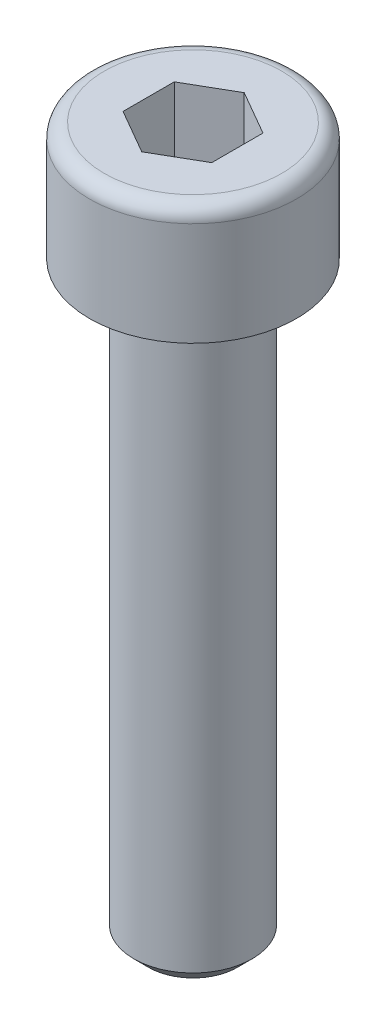
ISO-10303-21;
HEADER;
FILE_DESCRIPTION(('STEP AP214'),'2;1');
FILE_NAME('part.step','',(''),(''),'','','');
FILE_SCHEMA(('AUTOMOTIVE_DESIGN { 1 0 10303 214 1 1 1 1 }'));
ENDSEC;
DATA;
#1=APPLICATION_CONTEXT('core data for automotive mechanical design processes');
#2=APPLICATION_PROTOCOL_DEFINITION('international standard','automotive_design',2000,#1);
#3=PRODUCT_CONTEXT('',#1,'mechanical');
#4=PRODUCT('Part','Part','',(#3));
#5=PRODUCT_RELATED_PRODUCT_CATEGORY('part','',(#4));
#6=PRODUCT_DEFINITION_FORMATION('','',#4);
#7=PRODUCT_DEFINITION_CONTEXT('part definition',#1,'design');
#8=PRODUCT_DEFINITION('design','',#6,#7);
#9=PRODUCT_DEFINITION_SHAPE('','',#8);
#10=(LENGTH_UNIT() NAMED_UNIT(*) SI_UNIT(.MILLI.,.METRE.));
#11=(NAMED_UNIT(*) PLANE_ANGLE_UNIT() SI_UNIT($,.RADIAN.));
#12=(NAMED_UNIT(*) SI_UNIT($,.STERADIAN.) SOLID_ANGLE_UNIT());
#13=UNCERTAINTY_MEASURE_WITH_UNIT(LENGTH_MEASURE(1.E-05),#10,'distance_accuracy_value','');
#14=(GEOMETRIC_REPRESENTATION_CONTEXT(3) GLOBAL_UNCERTAINTY_ASSIGNED_CONTEXT((#13)) GLOBAL_UNIT_ASSIGNED_CONTEXT((#10,
#11,#12)) REPRESENTATION_CONTEXT('',''));
#15=CARTESIAN_POINT('',(0.,0.,0.));
#16=DIRECTION('',(0.,0.,1.));
#17=DIRECTION('',(1.,0.,0.));
#18=AXIS2_PLACEMENT_3D('',#15,#16,#17);
#19=CARTESIAN_POINT('',(0.,0.,0.));
#20=DIRECTION('',(0.,-1.,0.));
#21=DIRECTION('',(0.,0.,-1.));
#22=AXIS2_PLACEMENT_3D('',#19,#20,#21);
#23=PLANE('',#22);
#24=CARTESIAN_POINT('',(0.,0.,0.));
#25=DIRECTION('',(0.,-1.,0.));
#26=DIRECTION('',(0.,0.,-1.));
#27=AXIS2_PLACEMENT_3D('',#24,#25,#26);
#28=CIRCLE('',#27,3.);
#29=CARTESIAN_POINT('',(0.,0.,-3.));
#30=VERTEX_POINT('',#29);
#31=EDGE_CURVE('E42',#30,#30,#28,.F.);
#32=ORIENTED_EDGE('',*,*,#31,.T.);
#33=EDGE_LOOP('',(#32));
#34=FACE_BOUND('',#33,.T.);
#35=DIRECTION('',(-0.866025403784439,0.,-0.5));
#36=VECTOR('',#35,1.);
#37=CARTESIAN_POINT('',(1.5,0.,-0.866025403784438));
#38=LINE('',#37,#36);
#39=CARTESIAN_POINT('',(1.5,0.,-0.866025403784438));
#40=VERTEX_POINT('',#39);
#41=CARTESIAN_POINT('',(0.,0.,-1.73205080756888));
#42=VERTEX_POINT('',#41);
#43=EDGE_CURVE('E123',#40,#42,#38,.T.);
#44=ORIENTED_EDGE('',*,*,#43,.F.);
#45=DIRECTION('',(0.,0.,-1.));
#46=VECTOR('',#45,1.);
#47=CARTESIAN_POINT('',(1.5,0.,0.866025403784439));
#48=LINE('',#47,#46);
#49=CARTESIAN_POINT('',(1.5,0.,0.866025403784439));
#50=VERTEX_POINT('',#49);
#51=EDGE_CURVE('E49',#50,#40,#48,.T.);
#52=ORIENTED_EDGE('',*,*,#51,.F.);
#53=DIRECTION('',(0.866025403784439,0.,-0.5));
#54=VECTOR('',#53,1.);
#55=CARTESIAN_POINT('',(0.,0.,1.73205080756888));
#56=LINE('',#55,#54);
#57=CARTESIAN_POINT('',(0.,0.,1.73205080756888));
#58=VERTEX_POINT('',#57);
#59=EDGE_CURVE('E132',#58,#50,#56,.T.);
#60=ORIENTED_EDGE('',*,*,#59,.F.);
#61=DIRECTION('',(0.866025403784439,0.,0.5));
#62=VECTOR('',#61,1.);
#63=CARTESIAN_POINT('',(-1.5,0.,0.866025403784438));
#64=LINE('',#63,#62);
#65=CARTESIAN_POINT('',(-1.5,0.,0.866025403784438));
#66=VERTEX_POINT('',#65);
#67=EDGE_CURVE('E130',#66,#58,#64,.T.);
#68=ORIENTED_EDGE('',*,*,#67,.F.);
#69=DIRECTION('',(0.,0.,1.));
#70=VECTOR('',#69,1.);
#71=CARTESIAN_POINT('',(-1.5,0.,-0.866025403784439));
#72=LINE('',#71,#70);
#73=CARTESIAN_POINT('',(-1.5,0.,-0.866025403784439));
#74=VERTEX_POINT('',#73);
#75=EDGE_CURVE('E97',#74,#66,#72,.T.);
#76=ORIENTED_EDGE('',*,*,#75,.F.);
#77=DIRECTION('',(-0.866025403784439,0.,0.5));
#78=VECTOR('',#77,1.);
#79=CARTESIAN_POINT('',(0.,0.,-1.73205080756888));
#80=LINE('',#79,#78);
#81=EDGE_CURVE('E126',#42,#74,#80,.T.);
#82=ORIENTED_EDGE('',*,*,#81,.F.);
#83=EDGE_LOOP('',(#44,#52,#60,#68,#76,#82));
#84=FACE_BOUND('',#83,.T.);
#85=ADVANCED_FACE('F34',(#34,#84),#23,.F.);
#86=CARTESIAN_POINT('',(0.,0.,0.));
#87=DIRECTION('',(0.,1.,0.));
#88=DIRECTION('',(0.,0.,1.));
#89=AXIS2_PLACEMENT_3D('',#86,#87,#88);
#90=CYLINDRICAL_SURFACE('',#89,3.5);
#91=CARTESIAN_POINT('',(0.,-0.5,0.));
#92=DIRECTION('',(0.,-1.,0.));
#93=DIRECTION('',(0.,0.,-1.));
#94=AXIS2_PLACEMENT_3D('',#91,#92,#93);
#95=CIRCLE('',#94,3.5);
#96=CARTESIAN_POINT('',(0.,-0.5,-3.5));
#97=VERTEX_POINT('',#96);
#98=EDGE_CURVE('E11',#97,#97,#95,.T.);
#99=ORIENTED_EDGE('',*,*,#98,.T.);
#100=EDGE_LOOP('',(#99));
#101=FACE_BOUND('',#100,.T.);
#102=CARTESIAN_POINT('',(0.,-4.,0.));
#103=DIRECTION('',(0.,1.,0.));
#104=DIRECTION('',(0.,0.,1.));
#105=AXIS2_PLACEMENT_3D('',#102,#103,#104);
#106=CIRCLE('',#105,3.5);
#107=CARTESIAN_POINT('',(0.,-4.,3.5));
#108=VERTEX_POINT('',#107);
#109=EDGE_CURVE('E144',#108,#108,#106,.T.);
#110=ORIENTED_EDGE('',*,*,#109,.T.);
#111=EDGE_LOOP('',(#110));
#112=FACE_BOUND('',#111,.T.);
#113=ADVANCED_FACE('F166',(#101,#112),#90,.T.);
#114=CARTESIAN_POINT('',(3.5,-4.,0.));
#115=DIRECTION('',(0.,1.,0.));
#116=DIRECTION('',(0.,0.,1.));
#117=AXIS2_PLACEMENT_3D('',#114,#115,#116);
#118=PLANE('',#117);
#119=ORIENTED_EDGE('',*,*,#109,.F.);
#120=EDGE_LOOP('',(#119));
#121=FACE_BOUND('',#120,.T.);
#122=CARTESIAN_POINT('',(0.,-4.,0.));
#123=DIRECTION('',(0.,1.,0.));
#124=DIRECTION('',(0.,0.,1.));
#125=AXIS2_PLACEMENT_3D('',#122,#123,#124);
#126=CIRCLE('',#125,2.);
#127=CARTESIAN_POINT('',(0.,-4.,2.));
#128=VERTEX_POINT('',#127);
#129=EDGE_CURVE('E136',#128,#128,#126,.T.);
#130=ORIENTED_EDGE('',*,*,#129,.T.);
#131=EDGE_LOOP('',(#130));
#132=FACE_BOUND('',#131,.T.);
#133=ADVANCED_FACE('F171',(#121,#132),#118,.F.);
#134=CARTESIAN_POINT('',(0.,0.,0.));
#135=DIRECTION('',(0.,1.,0.));
#136=DIRECTION('',(0.,0.,1.));
#137=AXIS2_PLACEMENT_3D('',#134,#135,#136);
#138=CYLINDRICAL_SURFACE('',#137,2.);
#139=CARTESIAN_POINT('',(0.,-23.5,0.));
#140=DIRECTION('',(0.,1.,0.));
#141=DIRECTION('',(0.,0.,1.));
#142=AXIS2_PLACEMENT_3D('',#139,#140,#141);
#143=CIRCLE('',#142,2.);
#144=CARTESIAN_POINT('',(0.,-23.5,2.));
#145=VERTEX_POINT('',#144);
#146=EDGE_CURVE('E147',#145,#145,#143,.T.);
#147=ORIENTED_EDGE('',*,*,#146,.T.);
#148=EDGE_LOOP('',(#147));
#149=FACE_BOUND('',#148,.T.);
#150=ORIENTED_EDGE('',*,*,#129,.F.);
#151=EDGE_LOOP('',(#150));
#152=FACE_BOUND('',#151,.T.);
#153=ADVANCED_FACE('F177',(#149,#152),#138,.T.);
#154=CARTESIAN_POINT('',(2.,-24.,0.));
#155=DIRECTION('',(0.,1.,0.));
#156=DIRECTION('',(0.,0.,1.));
#157=AXIS2_PLACEMENT_3D('',#154,#155,#156);
#158=PLANE('',#157);
#159=CARTESIAN_POINT('',(0.,-24.,0.));
#160=DIRECTION('',(0.,1.,0.));
#161=DIRECTION('',(0.,0.,1.));
#162=AXIS2_PLACEMENT_3D('',#159,#160,#161);
#163=CIRCLE('',#162,1.5);
#164=CARTESIAN_POINT('',(0.,-24.,1.5));
#165=VERTEX_POINT('',#164);
#166=EDGE_CURVE('E150',#165,#165,#163,.F.);
#167=ORIENTED_EDGE('',*,*,#166,.T.);
#168=EDGE_LOOP('',(#167));
#169=FACE_BOUND('',#168,.T.);
#170=ADVANCED_FACE('F181',(#169),#158,.F.);
#171=CARTESIAN_POINT('',(1.5,-3.,0.866025403784439));
#172=DIRECTION('',(1.,0.,0.));
#173=DIRECTION('',(0.,0.,-1.));
#174=AXIS2_PLACEMENT_3D('',#171,#172,#173);
#175=PLANE('',#174);
#176=ORIENTED_EDGE('',*,*,#51,.T.);
#177=DIRECTION('',(0.,1.,0.));
#178=VECTOR('',#177,1.);
#179=CARTESIAN_POINT('',(1.5,-3.,-0.866025403784438));
#180=LINE('',#179,#178);
#181=CARTESIAN_POINT('',(1.5,-3.,-0.866025403784438));
#182=VERTEX_POINT('',#181);
#183=EDGE_CURVE('E79',#182,#40,#180,.T.);
#184=ORIENTED_EDGE('',*,*,#183,.F.);
#185=DIRECTION('',(0.,0.,-1.));
#186=VECTOR('',#185,1.);
#187=CARTESIAN_POINT('',(1.5,-3.,0.866025403784439));
#188=LINE('',#187,#186);
#189=CARTESIAN_POINT('',(1.5,-3.,0.866025403784439));
#190=VERTEX_POINT('',#189);
#191=EDGE_CURVE('E134',#190,#182,#188,.T.);
#192=ORIENTED_EDGE('',*,*,#191,.F.);
#193=DIRECTION('',(0.,1.,0.));
#194=VECTOR('',#193,1.);
#195=CARTESIAN_POINT('',(1.5,-3.,0.866025403784439));
#196=LINE('',#195,#194);
#197=EDGE_CURVE('E57',#190,#50,#196,.T.);
#198=ORIENTED_EDGE('',*,*,#197,.T.);
#199=EDGE_LOOP('',(#176,#184,#192,#198));
#200=FACE_BOUND('',#199,.T.);
#201=ADVANCED_FACE('F185',(#200),#175,.F.);
#202=CARTESIAN_POINT('',(0.,-3.,1.73205080756888));
#203=DIRECTION('',(0.5,0.,0.866025403784439));
#204=DIRECTION('',(0.866025403784439,0.,-0.5));
#205=AXIS2_PLACEMENT_3D('',#202,#203,#204);
#206=PLANE('',#205);
#207=ORIENTED_EDGE('',*,*,#59,.T.);
#208=ORIENTED_EDGE('',*,*,#197,.F.);
#209=DIRECTION('',(0.866025403784439,0.,-0.5));
#210=VECTOR('',#209,1.);
#211=CARTESIAN_POINT('',(0.,-3.,1.73205080756888));
#212=LINE('',#211,#210);
#213=CARTESIAN_POINT('',(0.,-3.,1.73205080756888));
#214=VERTEX_POINT('',#213);
#215=EDGE_CURVE('E109',#214,#190,#212,.T.);
#216=ORIENTED_EDGE('',*,*,#215,.F.);
#217=DIRECTION('',(0.,1.,0.));
#218=VECTOR('',#217,1.);
#219=CARTESIAN_POINT('',(0.,-3.,1.73205080756888));
#220=LINE('',#219,#218);
#221=EDGE_CURVE('E101',#214,#58,#220,.T.);
#222=ORIENTED_EDGE('',*,*,#221,.T.);
#223=EDGE_LOOP('',(#207,#208,#216,#222));
#224=FACE_BOUND('',#223,.T.);
#225=ADVANCED_FACE('F189',(#224),#206,.F.);
#226=CARTESIAN_POINT('',(-1.5,-3.,0.866025403784438));
#227=DIRECTION('',(-0.5,0.,0.866025403784438));
#228=DIRECTION('',(0.866025403784439,0.,0.5));
#229=AXIS2_PLACEMENT_3D('',#226,#227,#228);
#230=PLANE('',#229);
#231=ORIENTED_EDGE('',*,*,#67,.T.);
#232=ORIENTED_EDGE('',*,*,#221,.F.);
#233=DIRECTION('',(0.866025403784439,0.,0.5));
#234=VECTOR('',#233,1.);
#235=CARTESIAN_POINT('',(-1.5,-3.,0.866025403784438));
#236=LINE('',#235,#234);
#237=CARTESIAN_POINT('',(-1.5,-3.,0.866025403784438));
#238=VERTEX_POINT('',#237);
#239=EDGE_CURVE('E105',#238,#214,#236,.T.);
#240=ORIENTED_EDGE('',*,*,#239,.F.);
#241=DIRECTION('',(0.,1.,0.));
#242=VECTOR('',#241,1.);
#243=CARTESIAN_POINT('',(-1.5,-3.,0.866025403784438));
#244=LINE('',#243,#242);
#245=EDGE_CURVE('E90',#238,#66,#244,.T.);
#246=ORIENTED_EDGE('',*,*,#245,.T.);
#247=EDGE_LOOP('',(#231,#232,#240,#246));
#248=FACE_BOUND('',#247,.T.);
#249=ADVANCED_FACE('F106',(#248),#230,.F.);
#250=CARTESIAN_POINT('',(-1.5,-3.,-0.866025403784439));
#251=DIRECTION('',(-1.,0.,0.));
#252=DIRECTION('',(0.,0.,1.));
#253=AXIS2_PLACEMENT_3D('',#250,#251,#252);
#254=PLANE('',#253);
#255=ORIENTED_EDGE('',*,*,#75,.T.);
#256=ORIENTED_EDGE('',*,*,#245,.F.);
#257=DIRECTION('',(0.,0.,1.));
#258=VECTOR('',#257,1.);
#259=CARTESIAN_POINT('',(-1.5,-3.,-0.866025403784439));
#260=LINE('',#259,#258);
#261=CARTESIAN_POINT('',(-1.5,-3.,-0.866025403784439));
#262=VERTEX_POINT('',#261);
#263=EDGE_CURVE('E94',#262,#238,#260,.T.);
#264=ORIENTED_EDGE('',*,*,#263,.F.);
#265=DIRECTION('',(0.,1.,0.));
#266=VECTOR('',#265,1.);
#267=CARTESIAN_POINT('',(-1.5,-3.,-0.866025403784439));
#268=LINE('',#267,#266);
#269=EDGE_CURVE('E102',#262,#74,#268,.T.);
#270=ORIENTED_EDGE('',*,*,#269,.T.);
#271=EDGE_LOOP('',(#255,#256,#264,#270));
#272=FACE_BOUND('',#271,.T.);
#273=ADVANCED_FACE('F92',(#272),#254,.F.);
#274=CARTESIAN_POINT('',(0.,-3.,-1.73205080756888));
#275=DIRECTION('',(-0.5,0.,-0.866025403784439));
#276=DIRECTION('',(-0.866025403784439,0.,0.5));
#277=AXIS2_PLACEMENT_3D('',#274,#275,#276);
#278=PLANE('',#277);
#279=ORIENTED_EDGE('',*,*,#81,.T.);
#280=ORIENTED_EDGE('',*,*,#269,.F.);
#281=DIRECTION('',(-0.866025403784439,0.,0.5));
#282=VECTOR('',#281,1.);
#283=CARTESIAN_POINT('',(0.,-3.,-1.73205080756888));
#284=LINE('',#283,#282);
#285=CARTESIAN_POINT('',(0.,-3.,-1.73205080756888));
#286=VERTEX_POINT('',#285);
#287=EDGE_CURVE('E115',#286,#262,#284,.T.);
#288=ORIENTED_EDGE('',*,*,#287,.F.);
#289=DIRECTION('',(0.,1.,0.));
#290=VECTOR('',#289,1.);
#291=CARTESIAN_POINT('',(0.,-3.,-1.73205080756888));
#292=LINE('',#291,#290);
#293=EDGE_CURVE('E139',#286,#42,#292,.T.);
#294=ORIENTED_EDGE('',*,*,#293,.T.);
#295=EDGE_LOOP('',(#279,#280,#288,#294));
#296=FACE_BOUND('',#295,.T.);
#297=ADVANCED_FACE('F193',(#296),#278,.F.);
#298=CARTESIAN_POINT('',(1.5,-3.,-0.866025403784438));
#299=DIRECTION('',(0.5,0.,-0.866025403784439));
#300=DIRECTION('',(-0.866025403784439,0.,-0.5));
#301=AXIS2_PLACEMENT_3D('',#298,#299,#300);
#302=PLANE('',#301);
#303=ORIENTED_EDGE('',*,*,#43,.T.);
#304=ORIENTED_EDGE('',*,*,#293,.F.);
#305=DIRECTION('',(-0.866025403784439,0.,-0.5));
#306=VECTOR('',#305,1.);
#307=CARTESIAN_POINT('',(1.5,-3.,-0.866025403784438));
#308=LINE('',#307,#306);
#309=EDGE_CURVE('E117',#182,#286,#308,.T.);
#310=ORIENTED_EDGE('',*,*,#309,.F.);
#311=ORIENTED_EDGE('',*,*,#183,.T.);
#312=EDGE_LOOP('',(#303,#304,#310,#311));
#313=FACE_BOUND('',#312,.T.);
#314=ADVANCED_FACE('F190',(#313),#302,.F.);
#315=CARTESIAN_POINT('',(1.5,-3.,-0.866025403784438));
#316=DIRECTION('',(0.,1.,0.));
#317=DIRECTION('',(0.,0.,1.));
#318=AXIS2_PLACEMENT_3D('',#315,#316,#317);
#319=PLANE('',#318);
#320=ORIENTED_EDGE('',*,*,#191,.T.);
#321=ORIENTED_EDGE('',*,*,#309,.T.);
#322=ORIENTED_EDGE('',*,*,#287,.T.);
#323=ORIENTED_EDGE('',*,*,#263,.T.);
#324=ORIENTED_EDGE('',*,*,#239,.T.);
#325=ORIENTED_EDGE('',*,*,#215,.T.);
#326=EDGE_LOOP('',(#320,#321,#322,#323,#324,#325));
#327=FACE_BOUND('',#326,.T.);
#328=ADVANCED_FACE('F112',(#327),#319,.T.);
#329=CARTESIAN_POINT('',(0.,-23.5,0.));
#330=DIRECTION('',(0.,1.,0.));
#331=DIRECTION('',(0.,0.,1.));
#332=AXIS2_PLACEMENT_3D('',#329,#330,#331);
#333=CONICAL_SURFACE('',#332,2.,0.785398163397452);
#334=ORIENTED_EDGE('',*,*,#166,.F.);
#335=EDGE_LOOP('',(#334));
#336=FACE_BOUND('',#335,.T.);
#337=ORIENTED_EDGE('',*,*,#146,.F.);
#338=EDGE_LOOP('',(#337));
#339=FACE_BOUND('',#338,.T.);
#340=ADVANCED_FACE('F158',(#336,#339),#333,.T.);
#341=CARTESIAN_POINT('',(0.,-0.5,0.));
#342=DIRECTION('',(0.,-1.,0.));
#343=DIRECTION('',(0.,0.,-1.));
#344=AXIS2_PLACEMENT_3D('',#341,#342,#343);
#345=TOROIDAL_SURFACE('',#344,3.,0.5);
#346=ORIENTED_EDGE('',*,*,#98,.F.);
#347=EDGE_LOOP('',(#346));
#348=FACE_BOUND('',#347,.T.);
#349=ORIENTED_EDGE('',*,*,#31,.F.);
#350=EDGE_LOOP('',(#349));
#351=FACE_BOUND('',#350,.T.);
#352=ADVANCED_FACE('F36',(#348,#351),#345,.T.);
#353=CLOSED_SHELL('',(#85,#113,#133,#153,#170,#201,#225,#249,#273,#297,#314,#328,#340,#352));
#354=MANIFOLD_SOLID_BREP('B2',#353);
#355=ADVANCED_BREP_SHAPE_REPRESENTATION('',(#18,#354),#14);
#356=SHAPE_DEFINITION_REPRESENTATION(#9,#355);
ENDSEC;
END-ISO-10303-21;
